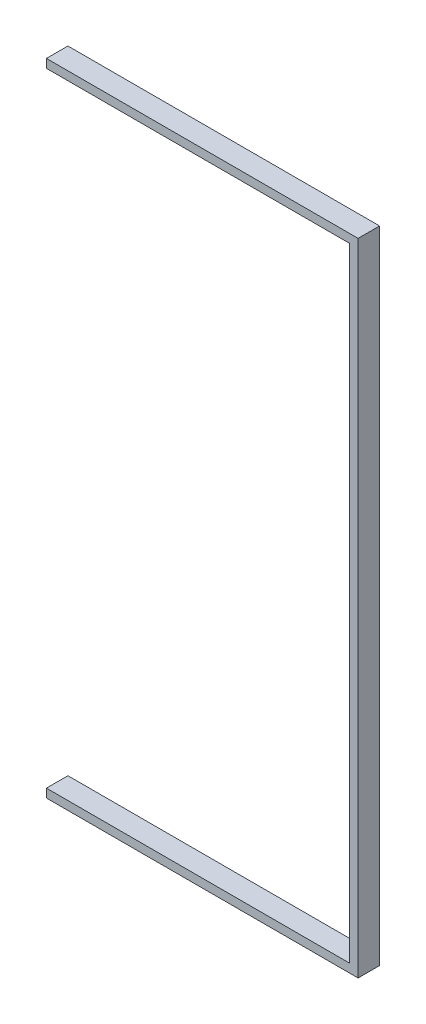
ISO-10303-21;
HEADER;
FILE_DESCRIPTION(('STEP AP214'),'2;1');
FILE_NAME('part.step','',(''),(''),'','','');
FILE_SCHEMA(('AUTOMOTIVE_DESIGN { 1 0 10303 214 1 1 1 1 }'));
ENDSEC;
DATA;
#1=APPLICATION_CONTEXT('core data for automotive mechanical design processes');
#2=APPLICATION_PROTOCOL_DEFINITION('international standard','automotive_design',2000,#1);
#3=PRODUCT_CONTEXT('',#1,'mechanical');
#4=PRODUCT('Part','Part','',(#3));
#5=PRODUCT_RELATED_PRODUCT_CATEGORY('part','',(#4));
#6=PRODUCT_DEFINITION_FORMATION('','',#4);
#7=PRODUCT_DEFINITION_CONTEXT('part definition',#1,'design');
#8=PRODUCT_DEFINITION('design','',#6,#7);
#9=PRODUCT_DEFINITION_SHAPE('','',#8);
#10=(LENGTH_UNIT() NAMED_UNIT(*) SI_UNIT(.MILLI.,.METRE.));
#11=(NAMED_UNIT(*) PLANE_ANGLE_UNIT() SI_UNIT($,.RADIAN.));
#12=(NAMED_UNIT(*) SI_UNIT($,.STERADIAN.) SOLID_ANGLE_UNIT());
#13=UNCERTAINTY_MEASURE_WITH_UNIT(LENGTH_MEASURE(1.E-05),#10,'distance_accuracy_value','');
#14=(GEOMETRIC_REPRESENTATION_CONTEXT(3) GLOBAL_UNCERTAINTY_ASSIGNED_CONTEXT((#13)) GLOBAL_UNIT_ASSIGNED_CONTEXT((#10,
#11,#12)) REPRESENTATION_CONTEXT('',''));
#15=CARTESIAN_POINT('',(0.,0.,0.));
#16=DIRECTION('',(0.,0.,1.));
#17=DIRECTION('',(1.,0.,0.));
#18=AXIS2_PLACEMENT_3D('',#15,#16,#17);
#19=CARTESIAN_POINT('',(-141.,45.0197869101977,10.));
#20=DIRECTION('',(1.,0.,0.));
#21=DIRECTION('',(0.,0.,-1.));
#22=AXIS2_PLACEMENT_3D('',#19,#20,#21);
#23=PLANE('',#22);
#24=DIRECTION('',(0.,-1.,0.));
#25=VECTOR('',#24,1.);
#26=CARTESIAN_POINT('',(-141.,45.0197869101977,0.));
#27=LINE('',#26,#25);
#28=CARTESIAN_POINT('',(-141.,45.0197869101977,0.));
#29=VERTEX_POINT('',#28);
#30=CARTESIAN_POINT('',(-141.,41.0197869101977,0.));
#31=VERTEX_POINT('',#30);
#32=EDGE_CURVE('E140',#29,#31,#27,.T.);
#33=ORIENTED_EDGE('',*,*,#32,.T.);
#34=DIRECTION('',(0.,0.,-1.));
#35=VECTOR('',#34,1.);
#36=CARTESIAN_POINT('',(-141.,41.0197869101977,10.));
#37=LINE('',#36,#35);
#38=CARTESIAN_POINT('',(-141.,41.0197869101977,10.));
#39=VERTEX_POINT('',#38);
#40=EDGE_CURVE('E11',#39,#31,#37,.T.);
#41=ORIENTED_EDGE('',*,*,#40,.F.);
#42=DIRECTION('',(0.,-1.,0.));
#43=VECTOR('',#42,1.);
#44=CARTESIAN_POINT('',(-141.,45.0197869101977,10.));
#45=LINE('',#44,#43);
#46=CARTESIAN_POINT('',(-141.,45.0197869101977,10.));
#47=VERTEX_POINT('',#46);
#48=EDGE_CURVE('E162',#47,#39,#45,.T.);
#49=ORIENTED_EDGE('',*,*,#48,.F.);
#50=DIRECTION('',(0.,0.,-1.));
#51=VECTOR('',#50,1.);
#52=CARTESIAN_POINT('',(-141.,45.0197869101977,10.));
#53=LINE('',#52,#51);
#54=EDGE_CURVE('E136',#47,#29,#53,.T.);
#55=ORIENTED_EDGE('',*,*,#54,.T.);
#56=EDGE_LOOP('',(#33,#41,#49,#55));
#57=FACE_BOUND('',#56,.T.);
#58=ADVANCED_FACE('F39',(#57),#23,.F.);
#59=CARTESIAN_POINT('',(-141.,41.0197869101977,10.));
#60=DIRECTION('',(0.,1.,0.));
#61=DIRECTION('',(0.,0.,1.));
#62=AXIS2_PLACEMENT_3D('',#59,#60,#61);
#63=PLANE('',#62);
#64=DIRECTION('',(1.,0.,0.));
#65=VECTOR('',#64,1.);
#66=CARTESIAN_POINT('',(-141.,41.0197869101977,0.));
#67=LINE('',#66,#65);
#68=CARTESIAN_POINT('',(0.,41.0197869101977,0.));
#69=VERTEX_POINT('',#68);
#70=EDGE_CURVE('E144',#31,#69,#67,.T.);
#71=ORIENTED_EDGE('',*,*,#70,.T.);
#72=DIRECTION('',(0.,0.,-1.));
#73=VECTOR('',#72,1.);
#74=CARTESIAN_POINT('',(0.,41.0197869101977,10.));
#75=LINE('',#74,#73);
#76=CARTESIAN_POINT('',(0.,41.0197869101977,10.));
#77=VERTEX_POINT('',#76);
#78=EDGE_CURVE('E48',#77,#69,#75,.T.);
#79=ORIENTED_EDGE('',*,*,#78,.F.);
#80=DIRECTION('',(1.,0.,0.));
#81=VECTOR('',#80,1.);
#82=CARTESIAN_POINT('',(-141.,41.0197869101977,10.));
#83=LINE('',#82,#81);
#84=EDGE_CURVE('E99',#39,#77,#83,.T.);
#85=ORIENTED_EDGE('',*,*,#84,.F.);
#86=ORIENTED_EDGE('',*,*,#40,.T.);
#87=EDGE_LOOP('',(#71,#79,#85,#86));
#88=FACE_BOUND('',#87,.T.);
#89=ADVANCED_FACE('F208',(#88),#63,.F.);
#90=CARTESIAN_POINT('',(0.,41.0197869101977,10.));
#91=DIRECTION('',(1.,0.,0.));
#92=DIRECTION('',(0.,1.,0.));
#93=AXIS2_PLACEMENT_3D('',#90,#91,#92);
#94=PLANE('',#93);
#95=DIRECTION('',(0.,-1.,0.));
#96=VECTOR('',#95,1.);
#97=CARTESIAN_POINT('',(0.,41.0197869101977,0.));
#98=LINE('',#97,#96);
#99=CARTESIAN_POINT('',(0.,-248.980213089802,0.));
#100=VERTEX_POINT('',#99);
#101=EDGE_CURVE('E147',#69,#100,#98,.T.);
#102=ORIENTED_EDGE('',*,*,#101,.T.);
#103=DIRECTION('',(0.,0.,-1.));
#104=VECTOR('',#103,1.);
#105=CARTESIAN_POINT('',(0.,-248.980213089802,10.));
#106=LINE('',#105,#104);
#107=CARTESIAN_POINT('',(0.,-248.980213089802,10.));
#108=VERTEX_POINT('',#107);
#109=EDGE_CURVE('E173',#108,#100,#106,.T.);
#110=ORIENTED_EDGE('',*,*,#109,.F.);
#111=DIRECTION('',(0.,-1.,0.));
#112=VECTOR('',#111,1.);
#113=CARTESIAN_POINT('',(0.,41.0197869101977,10.));
#114=LINE('',#113,#112);
#115=EDGE_CURVE('E183',#77,#108,#114,.T.);
#116=ORIENTED_EDGE('',*,*,#115,.F.);
#117=ORIENTED_EDGE('',*,*,#78,.T.);
#118=EDGE_LOOP('',(#102,#110,#116,#117));
#119=FACE_BOUND('',#118,.T.);
#120=ADVANCED_FACE('F181',(#119),#94,.F.);
#121=CARTESIAN_POINT('',(0.,-248.980213089802,10.));
#122=DIRECTION('',(0.,-1.,0.));
#123=DIRECTION('',(1.,0.,0.));
#124=AXIS2_PLACEMENT_3D('',#121,#122,#123);
#125=PLANE('',#124);
#126=DIRECTION('',(-1.,0.,0.));
#127=VECTOR('',#126,1.);
#128=CARTESIAN_POINT('',(0.,-248.980213089802,0.));
#129=LINE('',#128,#127);
#130=CARTESIAN_POINT('',(-141.,-248.980213089802,0.));
#131=VERTEX_POINT('',#130);
#132=EDGE_CURVE('E150',#100,#131,#129,.T.);
#133=ORIENTED_EDGE('',*,*,#132,.T.);
#134=DIRECTION('',(0.,0.,-1.));
#135=VECTOR('',#134,1.);
#136=CARTESIAN_POINT('',(-141.,-248.980213089802,10.));
#137=LINE('',#136,#135);
#138=CARTESIAN_POINT('',(-141.,-248.980213089802,10.));
#139=VERTEX_POINT('',#138);
#140=EDGE_CURVE('E169',#139,#131,#137,.T.);
#141=ORIENTED_EDGE('',*,*,#140,.F.);
#142=DIRECTION('',(-1.,0.,0.));
#143=VECTOR('',#142,1.);
#144=CARTESIAN_POINT('',(0.,-248.980213089802,10.));
#145=LINE('',#144,#143);
#146=EDGE_CURVE('E196',#108,#139,#145,.T.);
#147=ORIENTED_EDGE('',*,*,#146,.F.);
#148=ORIENTED_EDGE('',*,*,#109,.T.);
#149=EDGE_LOOP('',(#133,#141,#147,#148));
#150=FACE_BOUND('',#149,.T.);
#151=ADVANCED_FACE('F191',(#150),#125,.F.);
#152=CARTESIAN_POINT('',(-141.,-248.980213089802,10.));
#153=DIRECTION('',(1.,0.,0.));
#154=DIRECTION('',(0.,0.,-1.));
#155=AXIS2_PLACEMENT_3D('',#152,#153,#154);
#156=PLANE('',#155);
#157=DIRECTION('',(0.,-1.,0.));
#158=VECTOR('',#157,1.);
#159=CARTESIAN_POINT('',(-141.,-248.980213089802,0.));
#160=LINE('',#159,#158);
#161=CARTESIAN_POINT('',(-141.,-252.980213089802,0.));
#162=VERTEX_POINT('',#161);
#163=EDGE_CURVE('E153',#131,#162,#160,.T.);
#164=ORIENTED_EDGE('',*,*,#163,.T.);
#165=DIRECTION('',(0.,0.,-1.));
#166=VECTOR('',#165,1.);
#167=CARTESIAN_POINT('',(-141.,-252.980213089802,10.));
#168=LINE('',#167,#166);
#169=CARTESIAN_POINT('',(-141.,-252.980213089802,10.));
#170=VERTEX_POINT('',#169);
#171=EDGE_CURVE('E129',#170,#162,#168,.T.);
#172=ORIENTED_EDGE('',*,*,#171,.F.);
#173=DIRECTION('',(0.,-1.,0.));
#174=VECTOR('',#173,1.);
#175=CARTESIAN_POINT('',(-141.,-248.980213089802,10.));
#176=LINE('',#175,#174);
#177=EDGE_CURVE('E118',#139,#170,#176,.T.);
#178=ORIENTED_EDGE('',*,*,#177,.F.);
#179=ORIENTED_EDGE('',*,*,#140,.T.);
#180=EDGE_LOOP('',(#164,#172,#178,#179));
#181=FACE_BOUND('',#180,.T.);
#182=ADVANCED_FACE('F194',(#181),#156,.F.);
#183=CARTESIAN_POINT('',(-141.,-252.980213089802,10.));
#184=DIRECTION('',(0.,1.,0.));
#185=DIRECTION('',(0.,0.,1.));
#186=AXIS2_PLACEMENT_3D('',#183,#184,#185);
#187=PLANE('',#186);
#188=DIRECTION('',(1.,0.,0.));
#189=VECTOR('',#188,1.);
#190=CARTESIAN_POINT('',(-141.,-252.980213089802,0.));
#191=LINE('',#190,#189);
#192=CARTESIAN_POINT('',(4.00000000000003,-252.980213089802,0.));
#193=VERTEX_POINT('',#192);
#194=EDGE_CURVE('E127',#162,#193,#191,.T.);
#195=ORIENTED_EDGE('',*,*,#194,.T.);
#196=DIRECTION('',(0.,0.,-1.));
#197=VECTOR('',#196,1.);
#198=CARTESIAN_POINT('',(4.00000000000003,-252.980213089802,10.));
#199=LINE('',#198,#197);
#200=CARTESIAN_POINT('',(4.00000000000003,-252.980213089802,10.));
#201=VERTEX_POINT('',#200);
#202=EDGE_CURVE('E124',#201,#193,#199,.T.);
#203=ORIENTED_EDGE('',*,*,#202,.F.);
#204=DIRECTION('',(1.,0.,0.));
#205=VECTOR('',#204,1.);
#206=CARTESIAN_POINT('',(-141.,-252.980213089802,10.));
#207=LINE('',#206,#205);
#208=EDGE_CURVE('E112',#170,#201,#207,.T.);
#209=ORIENTED_EDGE('',*,*,#208,.F.);
#210=ORIENTED_EDGE('',*,*,#171,.T.);
#211=EDGE_LOOP('',(#195,#203,#209,#210));
#212=FACE_BOUND('',#211,.T.);
#213=ADVANCED_FACE('F125',(#212),#187,.F.);
#214=CARTESIAN_POINT('',(4.00000000000003,-252.980213089802,10.));
#215=DIRECTION('',(-1.,0.,0.));
#216=DIRECTION('',(0.,-1.,0.));
#217=AXIS2_PLACEMENT_3D('',#214,#215,#216);
#218=PLANE('',#217);
#219=DIRECTION('',(0.,1.,0.));
#220=VECTOR('',#219,1.);
#221=CARTESIAN_POINT('',(4.00000000000003,-252.980213089802,0.));
#222=LINE('',#221,#220);
#223=CARTESIAN_POINT('',(4.00000000000001,45.0197869101977,0.));
#224=VERTEX_POINT('',#223);
#225=EDGE_CURVE('E85',#193,#224,#222,.T.);
#226=ORIENTED_EDGE('',*,*,#225,.T.);
#227=DIRECTION('',(0.,0.,-1.));
#228=VECTOR('',#227,1.);
#229=CARTESIAN_POINT('',(4.00000000000001,45.0197869101977,10.));
#230=LINE('',#229,#228);
#231=CARTESIAN_POINT('',(4.00000000000001,45.0197869101977,10.));
#232=VERTEX_POINT('',#231);
#233=EDGE_CURVE('E130',#232,#224,#230,.T.);
#234=ORIENTED_EDGE('',*,*,#233,.F.);
#235=DIRECTION('',(0.,1.,0.));
#236=VECTOR('',#235,1.);
#237=CARTESIAN_POINT('',(4.00000000000003,-252.980213089802,10.));
#238=LINE('',#237,#236);
#239=EDGE_CURVE('E116',#201,#232,#238,.T.);
#240=ORIENTED_EDGE('',*,*,#239,.F.);
#241=ORIENTED_EDGE('',*,*,#202,.T.);
#242=EDGE_LOOP('',(#226,#234,#240,#241));
#243=FACE_BOUND('',#242,.T.);
#244=ADVANCED_FACE('F132',(#243),#218,.F.);
#245=CARTESIAN_POINT('',(4.00000000000001,45.0197869101977,10.));
#246=DIRECTION('',(0.,-1.,0.));
#247=DIRECTION('',(1.,0.,0.));
#248=AXIS2_PLACEMENT_3D('',#245,#246,#247);
#249=PLANE('',#248);
#250=DIRECTION('',(-1.,0.,0.));
#251=VECTOR('',#250,1.);
#252=CARTESIAN_POINT('',(4.00000000000001,45.0197869101977,0.));
#253=LINE('',#252,#251);
#254=EDGE_CURVE('E91',#224,#29,#253,.T.);
#255=ORIENTED_EDGE('',*,*,#254,.T.);
#256=ORIENTED_EDGE('',*,*,#54,.F.);
#257=DIRECTION('',(-1.,0.,0.));
#258=VECTOR('',#257,1.);
#259=CARTESIAN_POINT('',(4.00000000000001,45.0197869101977,10.));
#260=LINE('',#259,#258);
#261=EDGE_CURVE('E56',#232,#47,#260,.T.);
#262=ORIENTED_EDGE('',*,*,#261,.F.);
#263=ORIENTED_EDGE('',*,*,#233,.T.);
#264=EDGE_LOOP('',(#255,#256,#262,#263));
#265=FACE_BOUND('',#264,.T.);
#266=ADVANCED_FACE('F224',(#265),#249,.F.);
#267=CARTESIAN_POINT('',(0.,0.,10.));
#268=DIRECTION('',(0.,0.,1.));
#269=DIRECTION('',(1.,0.,0.));
#270=AXIS2_PLACEMENT_3D('',#267,#268,#269);
#271=PLANE('',#270);
#272=ORIENTED_EDGE('',*,*,#48,.T.);
#273=ORIENTED_EDGE('',*,*,#84,.T.);
#274=ORIENTED_EDGE('',*,*,#115,.T.);
#275=ORIENTED_EDGE('',*,*,#146,.T.);
#276=ORIENTED_EDGE('',*,*,#177,.T.);
#277=ORIENTED_EDGE('',*,*,#208,.T.);
#278=ORIENTED_EDGE('',*,*,#239,.T.);
#279=ORIENTED_EDGE('',*,*,#261,.T.);
#280=EDGE_LOOP('',(#272,#273,#274,#275,#276,#277,#278,#279));
#281=FACE_BOUND('',#280,.T.);
#282=ADVANCED_FACE('F114',(#281),#271,.T.);
#283=CARTESIAN_POINT('',(0.,0.,0.));
#284=DIRECTION('',(0.,0.,1.));
#285=DIRECTION('',(1.,0.,0.));
#286=AXIS2_PLACEMENT_3D('',#283,#284,#285);
#287=PLANE('',#286);
#288=ORIENTED_EDGE('',*,*,#32,.F.);
#289=ORIENTED_EDGE('',*,*,#254,.F.);
#290=ORIENTED_EDGE('',*,*,#225,.F.);
#291=ORIENTED_EDGE('',*,*,#194,.F.);
#292=ORIENTED_EDGE('',*,*,#163,.F.);
#293=ORIENTED_EDGE('',*,*,#132,.F.);
#294=ORIENTED_EDGE('',*,*,#101,.F.);
#295=ORIENTED_EDGE('',*,*,#70,.F.);
#296=EDGE_LOOP('',(#288,#289,#290,#291,#292,#293,#294,#295));
#297=FACE_BOUND('',#296,.T.);
#298=ADVANCED_FACE('F187',(#297),#287,.F.);
#299=CLOSED_SHELL('',(#58,#89,#120,#151,#182,#213,#244,#266,#282,#298));
#300=MANIFOLD_SOLID_BREP('B2',#299);
#301=ADVANCED_BREP_SHAPE_REPRESENTATION('',(#18,#300),#14);
#302=SHAPE_DEFINITION_REPRESENTATION(#9,#301);
ENDSEC;
END-ISO-10303-21;
